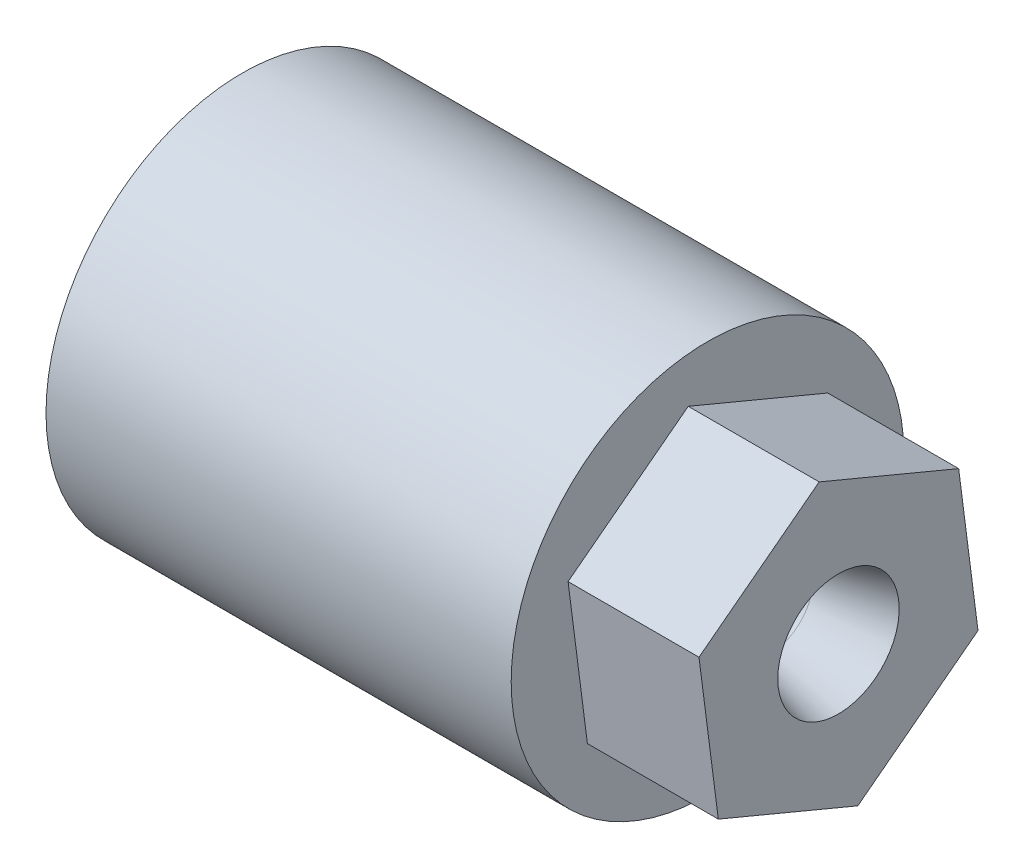
ISO-10303-21;
HEADER;
FILE_DESCRIPTION(('STEP AP214'),'2;1');
FILE_NAME('part.step','',(''),(''),'','','');
FILE_SCHEMA(('AUTOMOTIVE_DESIGN { 1 0 10303 214 1 1 1 1 }'));
ENDSEC;
DATA;
#1=APPLICATION_CONTEXT('core data for automotive mechanical design processes');
#2=APPLICATION_PROTOCOL_DEFINITION('international standard','automotive_design',2000,#1);
#3=PRODUCT_CONTEXT('',#1,'mechanical');
#4=PRODUCT('Part','Part','',(#3));
#5=PRODUCT_RELATED_PRODUCT_CATEGORY('part','',(#4));
#6=PRODUCT_DEFINITION_FORMATION('','',#4);
#7=PRODUCT_DEFINITION_CONTEXT('part definition',#1,'design');
#8=PRODUCT_DEFINITION('design','',#6,#7);
#9=PRODUCT_DEFINITION_SHAPE('','',#8);
#10=(LENGTH_UNIT() NAMED_UNIT(*) SI_UNIT(.MILLI.,.METRE.));
#11=(NAMED_UNIT(*) PLANE_ANGLE_UNIT() SI_UNIT($,.RADIAN.));
#12=(NAMED_UNIT(*) SI_UNIT($,.STERADIAN.) SOLID_ANGLE_UNIT());
#13=UNCERTAINTY_MEASURE_WITH_UNIT(LENGTH_MEASURE(1.E-05),#10,'distance_accuracy_value','');
#14=(GEOMETRIC_REPRESENTATION_CONTEXT(3) GLOBAL_UNCERTAINTY_ASSIGNED_CONTEXT((#13)) GLOBAL_UNIT_ASSIGNED_CONTEXT((#10,
#11,#12)) REPRESENTATION_CONTEXT('',''));
#15=CARTESIAN_POINT('',(0.,0.,0.));
#16=DIRECTION('',(0.,0.,1.));
#17=DIRECTION('',(1.,0.,0.));
#18=AXIS2_PLACEMENT_3D('',#15,#16,#17);
#19=CARTESIAN_POINT('',(3.51305494046218,9.525,0.));
#20=DIRECTION('',(-1.,0.,0.));
#21=DIRECTION('',(0.,0.,1.));
#22=AXIS2_PLACEMENT_3D('',#19,#20,#21);
#23=PLANE('',#22);
#24=CARTESIAN_POINT('',(3.51305494046218,0.,0.));
#25=DIRECTION('',(-1.,0.,0.));
#26=DIRECTION('',(0.,0.,1.));
#27=AXIS2_PLACEMENT_3D('',#24,#25,#26);
#28=CIRCLE('',#27,2.94464775482569);
#29=CARTESIAN_POINT('',(3.51305494046218,0.,2.94464775482569));
#30=VERTEX_POINT('',#29);
#31=EDGE_CURVE('E142',#30,#30,#28,.T.);
#32=ORIENTED_EDGE('',*,*,#31,.T.);
#33=EDGE_LOOP('',(#32));
#34=FACE_BOUND('',#33,.T.);
#35=DIRECTION('',(0.,-0.385175832029674,-0.922843203594331));
#36=VECTOR('',#35,1.);
#37=CARTESIAN_POINT('',(3.51305494046218,-5.860054342824,2.44586653338843));
#38=LINE('',#37,#36);
#39=CARTESIAN_POINT('',(3.51305494046218,-4.44793264137029,5.82917048568371));
#40=VERTEX_POINT('',#39);
#41=CARTESIAN_POINT('',(3.51305494046218,-7.27217604427771,-0.937437418906843));
#42=VERTEX_POINT('',#41);
#43=EDGE_CURVE('E49',#40,#42,#38,.T.);
#44=ORIENTED_EDGE('',*,*,#43,.T.);
#45=DIRECTION('',(0.,0.606617742007669,-0.794993657258671));
#46=VECTOR('',#45,1.);
#47=CARTESIAN_POINT('',(3.51305494046218,-5.04820972359256,-3.85202266174869));
#48=LINE('',#47,#46);
#49=CARTESIAN_POINT('',(3.51305494046218,-2.82424340290741,-6.76660790459055));
#50=VERTEX_POINT('',#49);
#51=EDGE_CURVE('E81',#42,#50,#48,.T.);
#52=ORIENTED_EDGE('',*,*,#51,.T.);
#53=DIRECTION('',(0.,0.991793574037343,0.12784954633566));
#54=VECTOR('',#53,1.);
#55=CARTESIAN_POINT('',(3.51305494046218,0.811844619231441,-6.29788919513713));
#56=LINE('',#55,#54);
#57=CARTESIAN_POINT('',(3.51305494046218,4.4479326413703,-5.8291704856837));
#58=VERTEX_POINT('',#57);
#59=EDGE_CURVE('E136',#50,#58,#56,.T.);
#60=ORIENTED_EDGE('',*,*,#59,.T.);
#61=DIRECTION('',(0.,0.385175832029674,0.922843203594331));
#62=VECTOR('',#61,1.);
#63=CARTESIAN_POINT('',(3.51305494046218,5.860054342824,-2.44586653338843));
#64=LINE('',#63,#62);
#65=CARTESIAN_POINT('',(3.51305494046218,7.27217604427771,0.937437418906843));
#66=VERTEX_POINT('',#65);
#67=EDGE_CURVE('E111',#58,#66,#64,.T.);
#68=ORIENTED_EDGE('',*,*,#67,.T.);
#69=DIRECTION('',(0.,-0.606617742007669,0.794993657258671));
#70=VECTOR('',#69,1.);
#71=CARTESIAN_POINT('',(3.51305494046218,5.04820972359256,3.85202266174869));
#72=LINE('',#71,#70);
#73=CARTESIAN_POINT('',(3.51305494046218,2.82424340290741,6.76660790459055));
#74=VERTEX_POINT('',#73);
#75=EDGE_CURVE('E132',#66,#74,#72,.T.);
#76=ORIENTED_EDGE('',*,*,#75,.T.);
#77=DIRECTION('',(0.,-0.991793574037343,-0.12784954633566));
#78=VECTOR('',#77,1.);
#79=CARTESIAN_POINT('',(3.51305494046218,-0.81184461923144,6.29788919513713));
#80=LINE('',#79,#78);
#81=EDGE_CURVE('E129',#74,#40,#80,.T.);
#82=ORIENTED_EDGE('',*,*,#81,.T.);
#83=EDGE_LOOP('',(#44,#52,#60,#68,#76,#82));
#84=FACE_BOUND('',#83,.T.);
#85=ADVANCED_FACE('F35',(#34,#84),#23,.F.);
#86=CARTESIAN_POINT('',(0.,0.,0.));
#87=DIRECTION('',(-1.,0.,0.));
#88=DIRECTION('',(0.,0.,1.));
#89=AXIS2_PLACEMENT_3D('',#86,#87,#88);
#90=CYLINDRICAL_SURFACE('',#89,9.525);
#91=CARTESIAN_POINT('',(-25.4,0.,0.));
#92=DIRECTION('',(-1.,0.,0.));
#93=DIRECTION('',(0.,0.,1.));
#94=AXIS2_PLACEMENT_3D('',#91,#92,#93);
#95=CIRCLE('',#94,9.525);
#96=CARTESIAN_POINT('',(-25.4,0.,9.525));
#97=VERTEX_POINT('',#96);
#98=EDGE_CURVE('E11',#97,#97,#95,.T.);
#99=ORIENTED_EDGE('',*,*,#98,.F.);
#100=EDGE_LOOP('',(#99));
#101=FACE_BOUND('',#100,.T.);
#102=CARTESIAN_POINT('',(-2.83694505953782,0.,0.));
#103=DIRECTION('',(1.,0.,0.));
#104=DIRECTION('',(0.,0.,-1.));
#105=AXIS2_PLACEMENT_3D('',#102,#103,#104);
#106=CIRCLE('',#105,9.525);
#107=CARTESIAN_POINT('',(-2.83694505953782,0.,-9.525));
#108=VERTEX_POINT('',#107);
#109=EDGE_CURVE('E124',#108,#108,#106,.T.);
#110=ORIENTED_EDGE('',*,*,#109,.F.);
#111=EDGE_LOOP('',(#110));
#112=FACE_BOUND('',#111,.T.);
#113=ADVANCED_FACE('F172',(#101,#112),#90,.T.);
#114=CARTESIAN_POINT('',(-25.4,5.74736391748426,0.));
#115=DIRECTION('',(1.,0.,0.));
#116=DIRECTION('',(0.,0.,-1.));
#117=AXIS2_PLACEMENT_3D('',#114,#115,#116);
#118=PLANE('',#117);
#119=CARTESIAN_POINT('',(-25.4,0.,0.));
#120=DIRECTION('',(-1.,0.,0.));
#121=DIRECTION('',(0.,0.,1.));
#122=AXIS2_PLACEMENT_3D('',#119,#120,#121);
#123=CIRCLE('',#122,5.74736391748426);
#124=CARTESIAN_POINT('',(-25.4,0.,5.74736391748426));
#125=VERTEX_POINT('',#124);
#126=EDGE_CURVE('E42',#125,#125,#123,.T.);
#127=ORIENTED_EDGE('',*,*,#126,.F.);
#128=EDGE_LOOP('',(#127));
#129=FACE_BOUND('',#128,.T.);
#130=ORIENTED_EDGE('',*,*,#98,.T.);
#131=EDGE_LOOP('',(#130));
#132=FACE_BOUND('',#131,.T.);
#133=ADVANCED_FACE('F169',(#129,#132),#118,.F.);
#134=CARTESIAN_POINT('',(0.,0.,0.));
#135=DIRECTION('',(-1.,0.,0.));
#136=DIRECTION('',(0.,0.,1.));
#137=AXIS2_PLACEMENT_3D('',#134,#135,#136);
#138=CYLINDRICAL_SURFACE('',#137,5.74736391748426);
#139=CARTESIAN_POINT('',(-6.29301491613203,0.,0.));
#140=DIRECTION('',(-1.,0.,0.));
#141=DIRECTION('',(0.,0.,1.));
#142=AXIS2_PLACEMENT_3D('',#139,#140,#141);
#143=CIRCLE('',#142,5.74736391748426);
#144=CARTESIAN_POINT('',(-6.29301491613203,0.,5.74736391748426));
#145=VERTEX_POINT('',#144);
#146=EDGE_CURVE('E162',#145,#145,#143,.T.);
#147=ORIENTED_EDGE('',*,*,#146,.F.);
#148=EDGE_LOOP('',(#147));
#149=FACE_BOUND('',#148,.T.);
#150=ORIENTED_EDGE('',*,*,#126,.T.);
#151=EDGE_LOOP('',(#150));
#152=FACE_BOUND('',#151,.T.);
#153=ADVANCED_FACE('F167',(#149,#152),#138,.F.);
#154=CARTESIAN_POINT('',(-6.29301491613202,0.,0.));
#155=DIRECTION('',(-1.,0.,0.));
#156=DIRECTION('',(0.,0.,1.));
#157=AXIS2_PLACEMENT_3D('',#154,#155,#156);
#158=DEGENERATE_TOROIDAL_SURFACE('',#157,2.57236391748426,3.175,.T.);
#159=CARTESIAN_POINT('',(-4.04795088586473,0.,0.));
#160=DIRECTION('',(-1.,0.,0.));
#161=DIRECTION('',(0.,0.,1.));
#162=AXIS2_PLACEMENT_3D('',#159,#160,#161);
#163=CIRCLE('',#162,4.81742794775155);
#164=CARTESIAN_POINT('',(-4.04795088586473,0.,4.81742794775155));
#165=VERTEX_POINT('',#164);
#166=EDGE_CURVE('E159',#165,#165,#163,.T.);
#167=ORIENTED_EDGE('',*,*,#166,.F.);
#168=EDGE_LOOP('',(#167));
#169=FACE_BOUND('',#168,.T.);
#170=ORIENTED_EDGE('',*,*,#146,.T.);
#171=EDGE_LOOP('',(#170));
#172=FACE_BOUND('',#171,.T.);
#173=ADVANCED_FACE('F227',(#169,#172),#158,.F.);
#174=CARTESIAN_POINT('',(-4.04795088586473,0.,0.));
#175=DIRECTION('',(-1.,0.,0.));
#176=DIRECTION('',(0.,0.,1.));
#177=AXIS2_PLACEMENT_3D('',#174,#175,#176);
#178=CONICAL_SURFACE('',#177,4.81742794775155,0.785398163397449);
#179=CARTESIAN_POINT('',(-2.1552614690566,0.,0.));
#180=DIRECTION('',(-1.,0.,0.));
#181=DIRECTION('',(0.,0.,1.));
#182=AXIS2_PLACEMENT_3D('',#179,#180,#181);
#183=CIRCLE('',#182,2.92473853094341);
#184=CARTESIAN_POINT('',(-2.1552614690566,0.,2.92473853094341));
#185=VERTEX_POINT('',#184);
#186=EDGE_CURVE('E156',#185,#185,#183,.T.);
#187=ORIENTED_EDGE('',*,*,#186,.F.);
#188=EDGE_LOOP('',(#187));
#189=FACE_BOUND('',#188,.T.);
#190=ORIENTED_EDGE('',*,*,#166,.T.);
#191=EDGE_LOOP('',(#190));
#192=FACE_BOUND('',#191,.T.);
#193=ADVANCED_FACE('F223',(#189,#192),#178,.F.);
#194=CARTESIAN_POINT('',(0.,0.,0.));
#195=DIRECTION('',(-1.,0.,0.));
#196=DIRECTION('',(0.,0.,1.));
#197=AXIS2_PLACEMENT_3D('',#194,#195,#196);
#198=TOROIDAL_SURFACE('',#197,5.08,3.048);
#199=CARTESIAN_POINT('',(0.,0.,0.));
#200=DIRECTION('',(-1.,0.,0.));
#201=DIRECTION('',(0.,0.,1.));
#202=AXIS2_PLACEMENT_3D('',#199,#200,#201);
#203=CIRCLE('',#202,2.032);
#204=CARTESIAN_POINT('',(0.,0.,2.032));
#205=VERTEX_POINT('',#204);
#206=EDGE_CURVE('E153',#205,#205,#203,.T.);
#207=ORIENTED_EDGE('',*,*,#206,.F.);
#208=EDGE_LOOP('',(#207));
#209=FACE_BOUND('',#208,.T.);
#210=ORIENTED_EDGE('',*,*,#186,.T.);
#211=EDGE_LOOP('',(#210));
#212=FACE_BOUND('',#211,.T.);
#213=ADVANCED_FACE('F219',(#209,#212),#198,.T.);
#214=CARTESIAN_POINT('',(0.,0.,0.));
#215=DIRECTION('',(-1.,0.,0.));
#216=DIRECTION('',(0.,0.,1.));
#217=AXIS2_PLACEMENT_3D('',#214,#215,#216);
#218=TOROIDAL_SURFACE('',#217,2.8448,0.8128);
#219=CARTESIAN_POINT('',(0.21036811985933,0.,0.));
#220=DIRECTION('',(-1.,0.,0.));
#221=DIRECTION('',(0.,0.,1.));
#222=AXIS2_PLACEMENT_3D('',#219,#220,#221);
#223=CIRCLE('',#222,2.05969548839225);
#224=CARTESIAN_POINT('',(0.21036811985933,0.,2.05969548839225));
#225=VERTEX_POINT('',#224);
#226=EDGE_CURVE('E150',#225,#225,#223,.T.);
#227=ORIENTED_EDGE('',*,*,#226,.F.);
#228=EDGE_LOOP('',(#227));
#229=FACE_BOUND('',#228,.T.);
#230=ORIENTED_EDGE('',*,*,#206,.T.);
#231=EDGE_LOOP('',(#230));
#232=FACE_BOUND('',#231,.T.);
#233=ADVANCED_FACE('F215',(#229,#232),#218,.T.);
#234=CARTESIAN_POINT('',(0.21036811985933,0.,0.));
#235=DIRECTION('',(1.,0.,0.));
#236=DIRECTION('',(0.,0.,-1.));
#237=AXIS2_PLACEMENT_3D('',#234,#235,#236);
#238=CONICAL_SURFACE('',#237,2.05969548839225,0.26179938779915);
#239=ORIENTED_EDGE('',*,*,#31,.F.);
#240=EDGE_LOOP('',(#239));
#241=FACE_BOUND('',#240,.T.);
#242=ORIENTED_EDGE('',*,*,#226,.T.);
#243=EDGE_LOOP('',(#242));
#244=FACE_BOUND('',#243,.T.);
#245=ADVANCED_FACE('F205',(#241,#244),#238,.F.);
#246=CARTESIAN_POINT('',(-2.83694505953782,-5.860054342824,2.44586653338843));
#247=DIRECTION('',(0.,-0.922843203594331,0.385175832029674));
#248=DIRECTION('',(0.,-0.385175832029674,-0.922843203594331));
#249=AXIS2_PLACEMENT_3D('',#246,#247,#248);
#250=PLANE('',#249);
#251=ORIENTED_EDGE('',*,*,#43,.F.);
#252=DIRECTION('',(1.,0.,0.));
#253=VECTOR('',#252,1.);
#254=CARTESIAN_POINT('',(-2.83694505953782,-4.44793264137029,5.82917048568371));
#255=LINE('',#254,#253);
#256=CARTESIAN_POINT('',(-2.83694505953782,-4.44793264137029,5.82917048568371));
#257=VERTEX_POINT('',#256);
#258=EDGE_CURVE('E127',#257,#40,#255,.T.);
#259=ORIENTED_EDGE('',*,*,#258,.F.);
#260=DIRECTION('',(0.,-0.385175832029674,-0.922843203594331));
#261=VECTOR('',#260,1.);
#262=CARTESIAN_POINT('',(-2.83694505953782,-5.860054342824,2.44586653338843));
#263=LINE('',#262,#261);
#264=CARTESIAN_POINT('',(-2.83694505953782,-7.27217604427771,-0.937437418906843));
#265=VERTEX_POINT('',#264);
#266=EDGE_CURVE('E139',#257,#265,#263,.T.);
#267=ORIENTED_EDGE('',*,*,#266,.T.);
#268=DIRECTION('',(1.,0.,0.));
#269=VECTOR('',#268,1.);
#270=CARTESIAN_POINT('',(-2.83694505953782,-7.27217604427771,-0.937437418906843));
#271=LINE('',#270,#269);
#272=EDGE_CURVE('E140',#265,#42,#271,.T.);
#273=ORIENTED_EDGE('',*,*,#272,.T.);
#274=EDGE_LOOP('',(#251,#259,#267,#273));
#275=FACE_BOUND('',#274,.T.);
#276=ADVANCED_FACE('F196',(#275),#250,.T.);
#277=CARTESIAN_POINT('',(-2.83694505953782,-5.04820972359256,-3.85202266174869));
#278=DIRECTION('',(0.,-0.794993657258671,-0.606617742007669));
#279=DIRECTION('',(0.,0.606617742007669,-0.794993657258671));
#280=AXIS2_PLACEMENT_3D('',#277,#278,#279);
#281=PLANE('',#280);
#282=ORIENTED_EDGE('',*,*,#51,.F.);
#283=ORIENTED_EDGE('',*,*,#272,.F.);
#284=DIRECTION('',(0.,0.606617742007669,-0.794993657258671));
#285=VECTOR('',#284,1.);
#286=CARTESIAN_POINT('',(-2.83694505953782,-5.04820972359256,-3.85202266174869));
#287=LINE('',#286,#285);
#288=CARTESIAN_POINT('',(-2.83694505953782,-2.82424340290741,-6.76660790459055));
#289=VERTEX_POINT('',#288);
#290=EDGE_CURVE('E58',#265,#289,#287,.T.);
#291=ORIENTED_EDGE('',*,*,#290,.T.);
#292=DIRECTION('',(1.,0.,0.));
#293=VECTOR('',#292,1.);
#294=CARTESIAN_POINT('',(-2.83694505953782,-2.82424340290741,-6.76660790459055));
#295=LINE('',#294,#293);
#296=EDGE_CURVE('E103',#289,#50,#295,.T.);
#297=ORIENTED_EDGE('',*,*,#296,.T.);
#298=EDGE_LOOP('',(#282,#283,#291,#297));
#299=FACE_BOUND('',#298,.T.);
#300=ADVANCED_FACE('F198',(#299),#281,.T.);
#301=CARTESIAN_POINT('',(-2.83694505953782,0.811844619231441,-6.29788919513713));
#302=DIRECTION('',(0.,0.12784954633566,-0.991793574037343));
#303=DIRECTION('',(0.,0.991793574037343,0.12784954633566));
#304=AXIS2_PLACEMENT_3D('',#301,#302,#303);
#305=PLANE('',#304);
#306=ORIENTED_EDGE('',*,*,#59,.F.);
#307=ORIENTED_EDGE('',*,*,#296,.F.);
#308=DIRECTION('',(0.,0.991793574037343,0.12784954633566));
#309=VECTOR('',#308,1.);
#310=CARTESIAN_POINT('',(-2.83694505953782,0.811844619231441,-6.29788919513713));
#311=LINE('',#310,#309);
#312=CARTESIAN_POINT('',(-2.83694505953782,4.4479326413703,-5.8291704856837));
#313=VERTEX_POINT('',#312);
#314=EDGE_CURVE('E97',#289,#313,#311,.T.);
#315=ORIENTED_EDGE('',*,*,#314,.T.);
#316=DIRECTION('',(1.,0.,0.));
#317=VECTOR('',#316,1.);
#318=CARTESIAN_POINT('',(-2.83694505953782,4.4479326413703,-5.8291704856837));
#319=LINE('',#318,#317);
#320=EDGE_CURVE('E101',#313,#58,#319,.T.);
#321=ORIENTED_EDGE('',*,*,#320,.T.);
#322=EDGE_LOOP('',(#306,#307,#315,#321));
#323=FACE_BOUND('',#322,.T.);
#324=ADVANCED_FACE('F100',(#323),#305,.T.);
#325=CARTESIAN_POINT('',(-2.83694505953782,5.860054342824,-2.44586653338843));
#326=DIRECTION('',(0.,0.922843203594331,-0.385175832029674));
#327=DIRECTION('',(0.,0.385175832029674,0.922843203594331));
#328=AXIS2_PLACEMENT_3D('',#325,#326,#327);
#329=PLANE('',#328);
#330=ORIENTED_EDGE('',*,*,#67,.F.);
#331=ORIENTED_EDGE('',*,*,#320,.F.);
#332=DIRECTION('',(0.,0.385175832029674,0.922843203594331));
#333=VECTOR('',#332,1.);
#334=CARTESIAN_POINT('',(-2.83694505953782,5.860054342824,-2.44586653338843));
#335=LINE('',#334,#333);
#336=CARTESIAN_POINT('',(-2.83694505953782,7.27217604427771,0.937437418906843));
#337=VERTEX_POINT('',#336);
#338=EDGE_CURVE('E105',#313,#337,#335,.T.);
#339=ORIENTED_EDGE('',*,*,#338,.T.);
#340=DIRECTION('',(1.,0.,0.));
#341=VECTOR('',#340,1.);
#342=CARTESIAN_POINT('',(-2.83694505953782,7.27217604427771,0.937437418906843));
#343=LINE('',#342,#341);
#344=EDGE_CURVE('E113',#337,#66,#343,.T.);
#345=ORIENTED_EDGE('',*,*,#344,.T.);
#346=EDGE_LOOP('',(#330,#331,#339,#345));
#347=FACE_BOUND('',#346,.T.);
#348=ADVANCED_FACE('F108',(#347),#329,.T.);
#349=CARTESIAN_POINT('',(-2.83694505953782,5.04820972359256,3.85202266174869));
#350=DIRECTION('',(0.,0.794993657258671,0.606617742007669));
#351=DIRECTION('',(0.,-0.606617742007669,0.794993657258671));
#352=AXIS2_PLACEMENT_3D('',#349,#350,#351);
#353=PLANE('',#352);
#354=ORIENTED_EDGE('',*,*,#75,.F.);
#355=ORIENTED_EDGE('',*,*,#344,.F.);
#356=DIRECTION('',(0.,-0.606617742007669,0.794993657258671));
#357=VECTOR('',#356,1.);
#358=CARTESIAN_POINT('',(-2.83694505953782,5.04820972359256,3.85202266174869));
#359=LINE('',#358,#357);
#360=CARTESIAN_POINT('',(-2.83694505953782,2.82424340290741,6.76660790459055));
#361=VERTEX_POINT('',#360);
#362=EDGE_CURVE('E118',#337,#361,#359,.T.);
#363=ORIENTED_EDGE('',*,*,#362,.T.);
#364=DIRECTION('',(1.,0.,0.));
#365=VECTOR('',#364,1.);
#366=CARTESIAN_POINT('',(-2.83694505953782,2.82424340290741,6.76660790459055));
#367=LINE('',#366,#365);
#368=EDGE_CURVE('E145',#361,#74,#367,.T.);
#369=ORIENTED_EDGE('',*,*,#368,.T.);
#370=EDGE_LOOP('',(#354,#355,#363,#369));
#371=FACE_BOUND('',#370,.T.);
#372=ADVANCED_FACE('F185',(#371),#353,.T.);
#373=CARTESIAN_POINT('',(-2.83694505953782,-0.81184461923144,6.29788919513713));
#374=DIRECTION('',(0.,-0.12784954633566,0.991793574037343));
#375=DIRECTION('',(0.,-0.991793574037343,-0.12784954633566));
#376=AXIS2_PLACEMENT_3D('',#373,#374,#375);
#377=PLANE('',#376);
#378=ORIENTED_EDGE('',*,*,#81,.F.);
#379=ORIENTED_EDGE('',*,*,#368,.F.);
#380=DIRECTION('',(0.,-0.991793574037343,-0.12784954633566));
#381=VECTOR('',#380,1.);
#382=CARTESIAN_POINT('',(-2.83694505953782,-0.81184461923144,6.29788919513713));
#383=LINE('',#382,#381);
#384=EDGE_CURVE('E88',#361,#257,#383,.T.);
#385=ORIENTED_EDGE('',*,*,#384,.T.);
#386=ORIENTED_EDGE('',*,*,#258,.T.);
#387=EDGE_LOOP('',(#378,#379,#385,#386));
#388=FACE_BOUND('',#387,.T.);
#389=ADVANCED_FACE('F180',(#388),#377,.T.);
#390=CARTESIAN_POINT('',(-2.83694505953782,0.,0.));
#391=DIRECTION('',(1.,0.,0.));
#392=DIRECTION('',(0.,0.,-1.));
#393=AXIS2_PLACEMENT_3D('',#390,#391,#392);
#394=PLANE('',#393);
#395=ORIENTED_EDGE('',*,*,#266,.F.);
#396=ORIENTED_EDGE('',*,*,#384,.F.);
#397=ORIENTED_EDGE('',*,*,#362,.F.);
#398=ORIENTED_EDGE('',*,*,#338,.F.);
#399=ORIENTED_EDGE('',*,*,#314,.F.);
#400=ORIENTED_EDGE('',*,*,#290,.F.);
#401=EDGE_LOOP('',(#395,#396,#397,#398,#399,#400));
#402=FACE_BOUND('',#401,.T.);
#403=ORIENTED_EDGE('',*,*,#109,.T.);
#404=EDGE_LOOP('',(#403));
#405=FACE_BOUND('',#404,.T.);
#406=ADVANCED_FACE('F116',(#402,#405),#394,.T.);
#407=CLOSED_SHELL('',(#85,#113,#133,#153,#173,#193,#213,#233,#245,#276,#300,#324,#348,#372,#389,#406));
#408=MANIFOLD_SOLID_BREP('B2',#407);
#409=ADVANCED_BREP_SHAPE_REPRESENTATION('',(#18,#408),#14);
#410=SHAPE_DEFINITION_REPRESENTATION(#9,#409);
ENDSEC;
END-ISO-10303-21;
